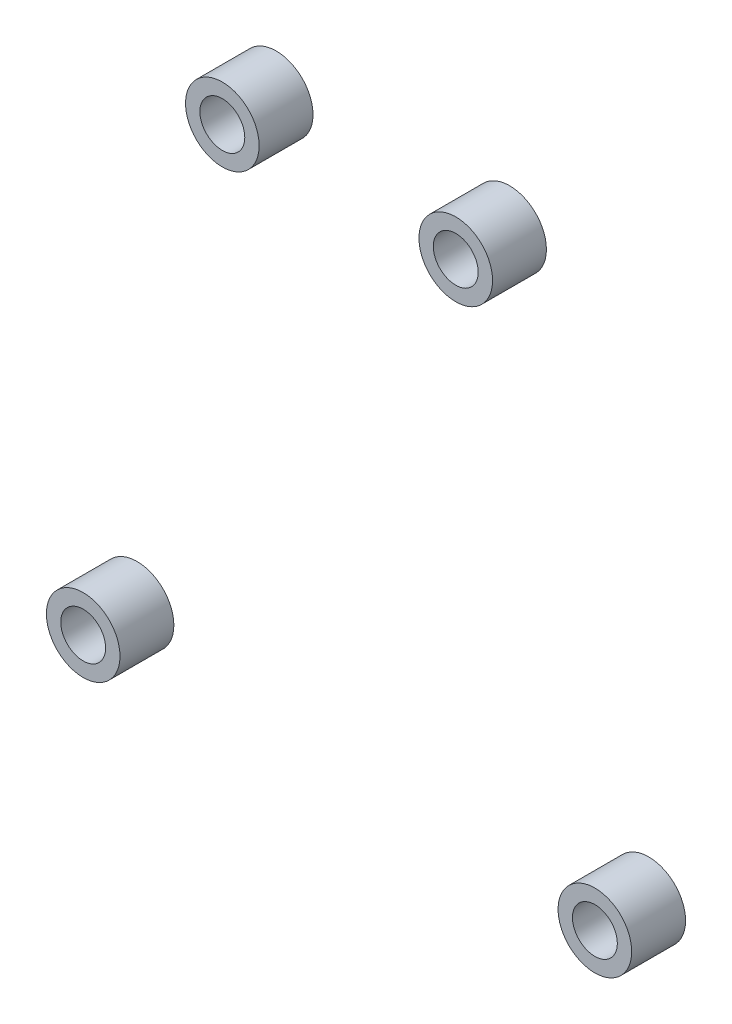
ISO-10303-21;
HEADER;
FILE_DESCRIPTION(('STEP AP214'),'2;1');
FILE_NAME('part.step','',(''),(''),'','','');
FILE_SCHEMA(('AUTOMOTIVE_DESIGN { 1 0 10303 214 1 1 1 1 }'));
ENDSEC;
DATA;
#1=APPLICATION_CONTEXT('core data for automotive mechanical design processes');
#2=APPLICATION_PROTOCOL_DEFINITION('international standard','automotive_design',2000,#1);
#3=PRODUCT_CONTEXT('',#1,'mechanical');
#4=PRODUCT('Part','Part','',(#3));
#5=PRODUCT_RELATED_PRODUCT_CATEGORY('part','',(#4));
#6=PRODUCT_DEFINITION_FORMATION('','',#4);
#7=PRODUCT_DEFINITION_CONTEXT('part definition',#1,'design');
#8=PRODUCT_DEFINITION('design','',#6,#7);
#9=PRODUCT_DEFINITION_SHAPE('','',#8);
#10=(LENGTH_UNIT() NAMED_UNIT(*) SI_UNIT(.MILLI.,.METRE.));
#11=(NAMED_UNIT(*) PLANE_ANGLE_UNIT() SI_UNIT($,.RADIAN.));
#12=(NAMED_UNIT(*) SI_UNIT($,.STERADIAN.) SOLID_ANGLE_UNIT());
#13=UNCERTAINTY_MEASURE_WITH_UNIT(LENGTH_MEASURE(1.E-05),#10,'distance_accuracy_value','');
#14=(GEOMETRIC_REPRESENTATION_CONTEXT(3) GLOBAL_UNCERTAINTY_ASSIGNED_CONTEXT((#13)) GLOBAL_UNIT_ASSIGNED_CONTEXT((#10,
#11,#12)) REPRESENTATION_CONTEXT('',''));
#15=CARTESIAN_POINT('',(0.,0.,0.));
#16=DIRECTION('',(0.,0.,1.));
#17=DIRECTION('',(1.,0.,0.));
#18=AXIS2_PLACEMENT_3D('',#15,#16,#17);
#19=CARTESIAN_POINT('',(-6.5,14.25,3.));
#20=DIRECTION('',(0.,0.,1.));
#21=DIRECTION('',(1.,0.,0.));
#22=AXIS2_PLACEMENT_3D('',#19,#20,#21);
#23=PLANE('',#22);
#24=CARTESIAN_POINT('',(-6.5,14.25,3.));
#25=DIRECTION('',(0.,0.,1.));
#26=DIRECTION('',(1.,0.,0.));
#27=AXIS2_PLACEMENT_3D('',#24,#25,#26);
#28=CIRCLE('',#27,2.05);
#29=CARTESIAN_POINT('',(-4.45,14.25,3.));
#30=VERTEX_POINT('',#29);
#31=EDGE_CURVE('E11',#30,#30,#28,.T.);
#32=ORIENTED_EDGE('',*,*,#31,.T.);
#33=EDGE_LOOP('',(#32));
#34=FACE_BOUND('',#33,.T.);
#35=CARTESIAN_POINT('',(-6.5,14.25,3.));
#36=DIRECTION('',(0.,0.,1.));
#37=DIRECTION('',(1.,0.,0.));
#38=AXIS2_PLACEMENT_3D('',#35,#36,#37);
#39=CIRCLE('',#38,1.25);
#40=CARTESIAN_POINT('',(-5.25,14.25,3.));
#41=VERTEX_POINT('',#40);
#42=EDGE_CURVE('E53',#41,#41,#39,.T.);
#43=ORIENTED_EDGE('',*,*,#42,.F.);
#44=EDGE_LOOP('',(#43));
#45=FACE_BOUND('',#44,.T.);
#46=ADVANCED_FACE('F42',(#34,#45),#23,.T.);
#47=CARTESIAN_POINT('',(-6.5,14.25,0.));
#48=DIRECTION('',(0.,0.,1.));
#49=DIRECTION('',(1.,0.,0.));
#50=AXIS2_PLACEMENT_3D('',#47,#48,#49);
#51=PLANE('',#50);
#52=CARTESIAN_POINT('',(-6.5,14.25,0.));
#53=DIRECTION('',(0.,0.,1.));
#54=DIRECTION('',(1.,0.,0.));
#55=AXIS2_PLACEMENT_3D('',#52,#53,#54);
#56=CIRCLE('',#55,2.05);
#57=CARTESIAN_POINT('',(-4.45,14.25,0.));
#58=VERTEX_POINT('',#57);
#59=EDGE_CURVE('E46',#58,#58,#56,.T.);
#60=ORIENTED_EDGE('',*,*,#59,.F.);
#61=EDGE_LOOP('',(#60));
#62=FACE_BOUND('',#61,.T.);
#63=CARTESIAN_POINT('',(-6.5,14.25,0.));
#64=DIRECTION('',(0.,0.,1.));
#65=DIRECTION('',(1.,0.,0.));
#66=AXIS2_PLACEMENT_3D('',#63,#64,#65);
#67=CIRCLE('',#66,1.25);
#68=CARTESIAN_POINT('',(-5.25,14.25,0.));
#69=VERTEX_POINT('',#68);
#70=EDGE_CURVE('E55',#69,#69,#67,.T.);
#71=ORIENTED_EDGE('',*,*,#70,.T.);
#72=EDGE_LOOP('',(#71));
#73=FACE_BOUND('',#72,.T.);
#74=ADVANCED_FACE('F65',(#62,#73),#51,.F.);
#75=CARTESIAN_POINT('',(-6.5,14.25,3.));
#76=DIRECTION('',(0.,0.,-1.));
#77=DIRECTION('',(-1.,0.,0.));
#78=AXIS2_PLACEMENT_3D('',#75,#76,#77);
#79=CYLINDRICAL_SURFACE('',#78,2.05);
#80=ORIENTED_EDGE('',*,*,#31,.F.);
#81=EDGE_LOOP('',(#80));
#82=FACE_BOUND('',#81,.T.);
#83=ORIENTED_EDGE('',*,*,#59,.T.);
#84=EDGE_LOOP('',(#83));
#85=FACE_BOUND('',#84,.T.);
#86=ADVANCED_FACE('F44',(#82,#85),#79,.T.);
#87=CARTESIAN_POINT('',(-6.5,14.25,3.));
#88=DIRECTION('',(0.,0.,-1.));
#89=DIRECTION('',(-1.,0.,0.));
#90=AXIS2_PLACEMENT_3D('',#87,#88,#89);
#91=CYLINDRICAL_SURFACE('',#90,1.25);
#92=ORIENTED_EDGE('',*,*,#42,.T.);
#93=EDGE_LOOP('',(#92));
#94=FACE_BOUND('',#93,.T.);
#95=ORIENTED_EDGE('',*,*,#70,.F.);
#96=EDGE_LOOP('',(#95));
#97=FACE_BOUND('',#96,.T.);
#98=ADVANCED_FACE('F61',(#94,#97),#91,.F.);
#99=CLOSED_SHELL('',(#46,#74,#86,#98));
#100=MANIFOLD_SOLID_BREP('B2',#99);
#101=CARTESIAN_POINT('',(-14.25,-14.25,3.));
#102=DIRECTION('',(0.,0.,1.));
#103=DIRECTION('',(1.,0.,0.));
#104=AXIS2_PLACEMENT_3D('',#101,#102,#103);
#105=PLANE('',#104);
#106=CARTESIAN_POINT('',(-14.25,-14.25,3.));
#107=DIRECTION('',(0.,0.,1.));
#108=DIRECTION('',(1.,0.,0.));
#109=AXIS2_PLACEMENT_3D('',#106,#107,#108);
#110=CIRCLE('',#109,2.05);
#111=CARTESIAN_POINT('',(-12.2,-14.25,3.));
#112=VERTEX_POINT('',#111);
#113=EDGE_CURVE('E41',#112,#112,#110,.T.);
#114=ORIENTED_EDGE('',*,*,#113,.T.);
#115=EDGE_LOOP('',(#114));
#116=FACE_BOUND('',#115,.T.);
#117=CARTESIAN_POINT('',(-14.25,-14.25,3.));
#118=DIRECTION('',(0.,0.,1.));
#119=DIRECTION('',(1.,0.,0.));
#120=AXIS2_PLACEMENT_3D('',#117,#118,#119);
#121=CIRCLE('',#120,1.25);
#122=CARTESIAN_POINT('',(-13.,-14.25,3.));
#123=VERTEX_POINT('',#122);
#124=EDGE_CURVE('E123',#123,#123,#121,.T.);
#125=ORIENTED_EDGE('',*,*,#124,.F.);
#126=EDGE_LOOP('',(#125));
#127=FACE_BOUND('',#126,.T.);
#128=ADVANCED_FACE('F112',(#116,#127),#105,.T.);
#129=CARTESIAN_POINT('',(-14.25,-14.25,0.));
#130=DIRECTION('',(0.,0.,1.));
#131=DIRECTION('',(1.,0.,0.));
#132=AXIS2_PLACEMENT_3D('',#129,#130,#131);
#133=PLANE('',#132);
#134=CARTESIAN_POINT('',(-14.25,-14.25,0.));
#135=DIRECTION('',(0.,0.,1.));
#136=DIRECTION('',(1.,0.,0.));
#137=AXIS2_PLACEMENT_3D('',#134,#135,#136);
#138=CIRCLE('',#137,2.05);
#139=CARTESIAN_POINT('',(-12.2,-14.25,0.));
#140=VERTEX_POINT('',#139);
#141=EDGE_CURVE('E116',#140,#140,#138,.T.);
#142=ORIENTED_EDGE('',*,*,#141,.F.);
#143=EDGE_LOOP('',(#142));
#144=FACE_BOUND('',#143,.T.);
#145=CARTESIAN_POINT('',(-14.25,-14.25,0.));
#146=DIRECTION('',(0.,0.,1.));
#147=DIRECTION('',(1.,0.,0.));
#148=AXIS2_PLACEMENT_3D('',#145,#146,#147);
#149=CIRCLE('',#148,1.25);
#150=CARTESIAN_POINT('',(-13.,-14.25,0.));
#151=VERTEX_POINT('',#150);
#152=EDGE_CURVE('E125',#151,#151,#149,.T.);
#153=ORIENTED_EDGE('',*,*,#152,.T.);
#154=EDGE_LOOP('',(#153));
#155=FACE_BOUND('',#154,.T.);
#156=ADVANCED_FACE('F135',(#144,#155),#133,.F.);
#157=CARTESIAN_POINT('',(-14.25,-14.25,3.));
#158=DIRECTION('',(0.,0.,-1.));
#159=DIRECTION('',(-1.,0.,0.));
#160=AXIS2_PLACEMENT_3D('',#157,#158,#159);
#161=CYLINDRICAL_SURFACE('',#160,2.05);
#162=ORIENTED_EDGE('',*,*,#113,.F.);
#163=EDGE_LOOP('',(#162));
#164=FACE_BOUND('',#163,.T.);
#165=ORIENTED_EDGE('',*,*,#141,.T.);
#166=EDGE_LOOP('',(#165));
#167=FACE_BOUND('',#166,.T.);
#168=ADVANCED_FACE('F114',(#164,#167),#161,.T.);
#169=CARTESIAN_POINT('',(-14.25,-14.25,3.));
#170=DIRECTION('',(0.,0.,-1.));
#171=DIRECTION('',(-1.,0.,0.));
#172=AXIS2_PLACEMENT_3D('',#169,#170,#171);
#173=CYLINDRICAL_SURFACE('',#172,1.25);
#174=ORIENTED_EDGE('',*,*,#124,.T.);
#175=EDGE_LOOP('',(#174));
#176=FACE_BOUND('',#175,.T.);
#177=ORIENTED_EDGE('',*,*,#152,.F.);
#178=EDGE_LOOP('',(#177));
#179=FACE_BOUND('',#178,.T.);
#180=ADVANCED_FACE('F131',(#176,#179),#173,.F.);
#181=CLOSED_SHELL('',(#128,#156,#168,#180));
#182=MANIFOLD_SOLID_BREP('B6',#181);
#183=CARTESIAN_POINT('',(14.25,-14.25,3.));
#184=DIRECTION('',(0.,0.,1.));
#185=DIRECTION('',(1.,0.,0.));
#186=AXIS2_PLACEMENT_3D('',#183,#184,#185);
#187=PLANE('',#186);
#188=CARTESIAN_POINT('',(14.25,-14.25,3.));
#189=DIRECTION('',(0.,0.,1.));
#190=DIRECTION('',(1.,0.,0.));
#191=AXIS2_PLACEMENT_3D('',#188,#189,#190);
#192=CIRCLE('',#191,2.05);
#193=CARTESIAN_POINT('',(16.3,-14.25,3.));
#194=VERTEX_POINT('',#193);
#195=EDGE_CURVE('E111',#194,#194,#192,.T.);
#196=ORIENTED_EDGE('',*,*,#195,.T.);
#197=EDGE_LOOP('',(#196));
#198=FACE_BOUND('',#197,.T.);
#199=CARTESIAN_POINT('',(14.25,-14.25,3.));
#200=DIRECTION('',(0.,0.,1.));
#201=DIRECTION('',(1.,0.,0.));
#202=AXIS2_PLACEMENT_3D('',#199,#200,#201);
#203=CIRCLE('',#202,1.25);
#204=CARTESIAN_POINT('',(15.5,-14.25,3.));
#205=VERTEX_POINT('',#204);
#206=EDGE_CURVE('E192',#205,#205,#203,.T.);
#207=ORIENTED_EDGE('',*,*,#206,.F.);
#208=EDGE_LOOP('',(#207));
#209=FACE_BOUND('',#208,.T.);
#210=ADVANCED_FACE('F181',(#198,#209),#187,.T.);
#211=CARTESIAN_POINT('',(14.25,-14.25,0.));
#212=DIRECTION('',(0.,0.,1.));
#213=DIRECTION('',(1.,0.,0.));
#214=AXIS2_PLACEMENT_3D('',#211,#212,#213);
#215=PLANE('',#214);
#216=CARTESIAN_POINT('',(14.25,-14.25,0.));
#217=DIRECTION('',(0.,0.,1.));
#218=DIRECTION('',(1.,0.,0.));
#219=AXIS2_PLACEMENT_3D('',#216,#217,#218);
#220=CIRCLE('',#219,2.05);
#221=CARTESIAN_POINT('',(16.3,-14.25,0.));
#222=VERTEX_POINT('',#221);
#223=EDGE_CURVE('E185',#222,#222,#220,.T.);
#224=ORIENTED_EDGE('',*,*,#223,.F.);
#225=EDGE_LOOP('',(#224));
#226=FACE_BOUND('',#225,.T.);
#227=CARTESIAN_POINT('',(14.25,-14.25,0.));
#228=DIRECTION('',(0.,0.,1.));
#229=DIRECTION('',(1.,0.,0.));
#230=AXIS2_PLACEMENT_3D('',#227,#228,#229);
#231=CIRCLE('',#230,1.25);
#232=CARTESIAN_POINT('',(15.5,-14.25,0.));
#233=VERTEX_POINT('',#232);
#234=EDGE_CURVE('E194',#233,#233,#231,.T.);
#235=ORIENTED_EDGE('',*,*,#234,.T.);
#236=EDGE_LOOP('',(#235));
#237=FACE_BOUND('',#236,.T.);
#238=ADVANCED_FACE('F204',(#226,#237),#215,.F.);
#239=CARTESIAN_POINT('',(14.25,-14.25,3.));
#240=DIRECTION('',(0.,0.,-1.));
#241=DIRECTION('',(-1.,0.,0.));
#242=AXIS2_PLACEMENT_3D('',#239,#240,#241);
#243=CYLINDRICAL_SURFACE('',#242,2.05);
#244=ORIENTED_EDGE('',*,*,#195,.F.);
#245=EDGE_LOOP('',(#244));
#246=FACE_BOUND('',#245,.T.);
#247=ORIENTED_EDGE('',*,*,#223,.T.);
#248=EDGE_LOOP('',(#247));
#249=FACE_BOUND('',#248,.T.);
#250=ADVANCED_FACE('F183',(#246,#249),#243,.T.);
#251=CARTESIAN_POINT('',(14.25,-14.25,3.));
#252=DIRECTION('',(0.,0.,-1.));
#253=DIRECTION('',(-1.,0.,0.));
#254=AXIS2_PLACEMENT_3D('',#251,#252,#253);
#255=CYLINDRICAL_SURFACE('',#254,1.25);
#256=ORIENTED_EDGE('',*,*,#206,.T.);
#257=EDGE_LOOP('',(#256));
#258=FACE_BOUND('',#257,.T.);
#259=ORIENTED_EDGE('',*,*,#234,.F.);
#260=EDGE_LOOP('',(#259));
#261=FACE_BOUND('',#260,.T.);
#262=ADVANCED_FACE('F200',(#258,#261),#255,.F.);
#263=CLOSED_SHELL('',(#210,#238,#250,#262));
#264=MANIFOLD_SOLID_BREP('B36',#263);
#265=CARTESIAN_POINT('',(6.5,14.25,3.));
#266=DIRECTION('',(0.,0.,1.));
#267=DIRECTION('',(1.,0.,0.));
#268=AXIS2_PLACEMENT_3D('',#265,#266,#267);
#269=PLANE('',#268);
#270=CARTESIAN_POINT('',(6.5,14.25,3.));
#271=DIRECTION('',(0.,0.,1.));
#272=DIRECTION('',(1.,0.,0.));
#273=AXIS2_PLACEMENT_3D('',#270,#271,#272);
#274=CIRCLE('',#273,2.05);
#275=CARTESIAN_POINT('',(8.55,14.25,3.));
#276=VERTEX_POINT('',#275);
#277=EDGE_CURVE('E180',#276,#276,#274,.T.);
#278=ORIENTED_EDGE('',*,*,#277,.T.);
#279=EDGE_LOOP('',(#278));
#280=FACE_BOUND('',#279,.T.);
#281=CARTESIAN_POINT('',(6.5,14.25,3.));
#282=DIRECTION('',(0.,0.,1.));
#283=DIRECTION('',(1.,0.,0.));
#284=AXIS2_PLACEMENT_3D('',#281,#282,#283);
#285=CIRCLE('',#284,1.25);
#286=CARTESIAN_POINT('',(7.75,14.25,3.));
#287=VERTEX_POINT('',#286);
#288=EDGE_CURVE('E254',#287,#287,#285,.T.);
#289=ORIENTED_EDGE('',*,*,#288,.F.);
#290=EDGE_LOOP('',(#289));
#291=FACE_BOUND('',#290,.T.);
#292=ADVANCED_FACE('F243',(#280,#291),#269,.T.);
#293=CARTESIAN_POINT('',(6.5,14.25,0.));
#294=DIRECTION('',(0.,0.,1.));
#295=DIRECTION('',(1.,0.,0.));
#296=AXIS2_PLACEMENT_3D('',#293,#294,#295);
#297=PLANE('',#296);
#298=CARTESIAN_POINT('',(6.5,14.25,0.));
#299=DIRECTION('',(0.,0.,1.));
#300=DIRECTION('',(1.,0.,0.));
#301=AXIS2_PLACEMENT_3D('',#298,#299,#300);
#302=CIRCLE('',#301,2.05);
#303=CARTESIAN_POINT('',(8.55,14.25,0.));
#304=VERTEX_POINT('',#303);
#305=EDGE_CURVE('E247',#304,#304,#302,.T.);
#306=ORIENTED_EDGE('',*,*,#305,.F.);
#307=EDGE_LOOP('',(#306));
#308=FACE_BOUND('',#307,.T.);
#309=CARTESIAN_POINT('',(6.5,14.25,0.));
#310=DIRECTION('',(0.,0.,1.));
#311=DIRECTION('',(1.,0.,0.));
#312=AXIS2_PLACEMENT_3D('',#309,#310,#311);
#313=CIRCLE('',#312,1.25);
#314=CARTESIAN_POINT('',(7.75,14.25,0.));
#315=VERTEX_POINT('',#314);
#316=EDGE_CURVE('E256',#315,#315,#313,.T.);
#317=ORIENTED_EDGE('',*,*,#316,.T.);
#318=EDGE_LOOP('',(#317));
#319=FACE_BOUND('',#318,.T.);
#320=ADVANCED_FACE('F266',(#308,#319),#297,.F.);
#321=CARTESIAN_POINT('',(6.5,14.25,3.));
#322=DIRECTION('',(0.,0.,-1.));
#323=DIRECTION('',(-1.,0.,0.));
#324=AXIS2_PLACEMENT_3D('',#321,#322,#323);
#325=CYLINDRICAL_SURFACE('',#324,2.05);
#326=ORIENTED_EDGE('',*,*,#277,.F.);
#327=EDGE_LOOP('',(#326));
#328=FACE_BOUND('',#327,.T.);
#329=ORIENTED_EDGE('',*,*,#305,.T.);
#330=EDGE_LOOP('',(#329));
#331=FACE_BOUND('',#330,.T.);
#332=ADVANCED_FACE('F245',(#328,#331),#325,.T.);
#333=CARTESIAN_POINT('',(6.5,14.25,3.));
#334=DIRECTION('',(0.,0.,-1.));
#335=DIRECTION('',(-1.,0.,0.));
#336=AXIS2_PLACEMENT_3D('',#333,#334,#335);
#337=CYLINDRICAL_SURFACE('',#336,1.25);
#338=ORIENTED_EDGE('',*,*,#288,.T.);
#339=EDGE_LOOP('',(#338));
#340=FACE_BOUND('',#339,.T.);
#341=ORIENTED_EDGE('',*,*,#316,.F.);
#342=EDGE_LOOP('',(#341));
#343=FACE_BOUND('',#342,.T.);
#344=ADVANCED_FACE('F262',(#340,#343),#337,.F.);
#345=CLOSED_SHELL('',(#292,#320,#332,#344));
#346=MANIFOLD_SOLID_BREP('B106',#345);
#347=ADVANCED_BREP_SHAPE_REPRESENTATION('',(#18,#100,#182,#264,#346),#14);
#348=SHAPE_DEFINITION_REPRESENTATION(#9,#347);
ENDSEC;
END-ISO-10303-21;
